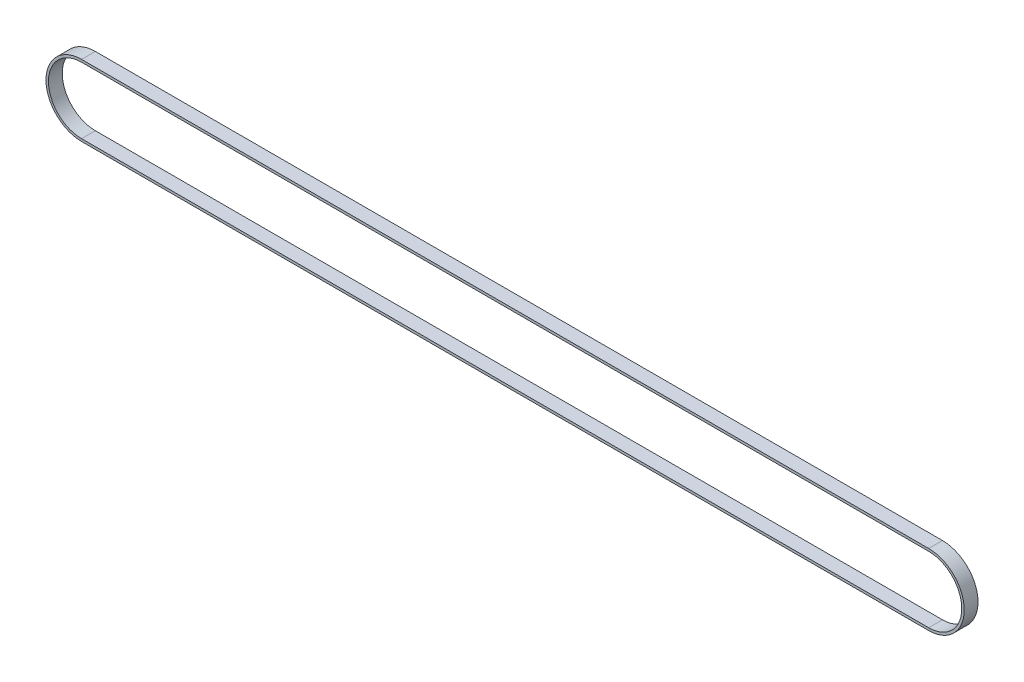
ISO-10303-21;
HEADER;
FILE_DESCRIPTION(('STEP AP214'),'2;1');
FILE_NAME('part.step','',(''),(''),'','','');
FILE_SCHEMA(('AUTOMOTIVE_DESIGN { 1 0 10303 214 1 1 1 1 }'));
ENDSEC;
DATA;
#1=APPLICATION_CONTEXT('core data for automotive mechanical design processes');
#2=APPLICATION_PROTOCOL_DEFINITION('international standard','automotive_design',2000,#1);
#3=PRODUCT_CONTEXT('',#1,'mechanical');
#4=PRODUCT('Part','Part','',(#3));
#5=PRODUCT_RELATED_PRODUCT_CATEGORY('part','',(#4));
#6=PRODUCT_DEFINITION_FORMATION('','',#4);
#7=PRODUCT_DEFINITION_CONTEXT('part definition',#1,'design');
#8=PRODUCT_DEFINITION('design','',#6,#7);
#9=PRODUCT_DEFINITION_SHAPE('','',#8);
#10=(LENGTH_UNIT() NAMED_UNIT(*) SI_UNIT(.MILLI.,.METRE.));
#11=(NAMED_UNIT(*) PLANE_ANGLE_UNIT() SI_UNIT($,.RADIAN.));
#12=(NAMED_UNIT(*) SI_UNIT($,.STERADIAN.) SOLID_ANGLE_UNIT());
#13=UNCERTAINTY_MEASURE_WITH_UNIT(LENGTH_MEASURE(1.E-05),#10,'distance_accuracy_value','');
#14=(GEOMETRIC_REPRESENTATION_CONTEXT(3) GLOBAL_UNCERTAINTY_ASSIGNED_CONTEXT((#13)) GLOBAL_UNIT_ASSIGNED_CONTEXT((#10,
#11,#12)) REPRESENTATION_CONTEXT('',''));
#15=CARTESIAN_POINT('',(0.,0.,0.));
#16=DIRECTION('',(0.,0.,1.));
#17=DIRECTION('',(1.,0.,0.));
#18=AXIS2_PLACEMENT_3D('',#15,#16,#17);
#19=CARTESIAN_POINT('',(0.,0.,12.7));
#20=DIRECTION('',(0.,0.,1.));
#21=DIRECTION('',(1.,0.,0.));
#22=AXIS2_PLACEMENT_3D('',#19,#20,#21);
#23=PLANE('',#22);
#24=CARTESIAN_POINT('',(0.,0.,12.7));
#25=DIRECTION('',(0.,0.,1.));
#26=DIRECTION('',(1.,0.,0.));
#27=AXIS2_PLACEMENT_3D('',#24,#25,#26);
#28=CIRCLE('',#27,32.74);
#29=CARTESIAN_POINT('',(0.,32.74,12.7));
#30=VERTEX_POINT('',#29);
#31=CARTESIAN_POINT('',(0.,-32.74,12.7));
#32=VERTEX_POINT('',#31);
#33=EDGE_CURVE('E134',#30,#32,#28,.T.);
#34=ORIENTED_EDGE('',*,*,#33,.T.);
#35=DIRECTION('',(1.,0.,0.));
#36=VECTOR('',#35,1.);
#37=CARTESIAN_POINT('',(0.,-32.74,12.7));
#38=LINE('',#37,#36);
#39=CARTESIAN_POINT('',(780.,-32.74,12.7));
#40=VERTEX_POINT('',#39);
#41=EDGE_CURVE('E137',#32,#40,#38,.T.);
#42=ORIENTED_EDGE('',*,*,#41,.T.);
#43=CARTESIAN_POINT('',(780.,0.,12.7));
#44=DIRECTION('',(0.,0.,1.));
#45=DIRECTION('',(1.,0.,0.));
#46=AXIS2_PLACEMENT_3D('',#43,#44,#45);
#47=CIRCLE('',#46,32.74);
#48=CARTESIAN_POINT('',(780.,32.74,12.7));
#49=VERTEX_POINT('',#48);
#50=EDGE_CURVE('E140',#40,#49,#47,.T.);
#51=ORIENTED_EDGE('',*,*,#50,.T.);
#52=DIRECTION('',(-1.,0.,0.));
#53=VECTOR('',#52,1.);
#54=CARTESIAN_POINT('',(0.,32.74,12.7));
#55=LINE('',#54,#53);
#56=EDGE_CURVE('E142',#49,#30,#55,.T.);
#57=ORIENTED_EDGE('',*,*,#56,.T.);
#58=EDGE_LOOP('',(#34,#42,#51,#57));
#59=FACE_BOUND('',#58,.T.);
#60=DIRECTION('',(1.,0.,0.));
#61=VECTOR('',#60,1.);
#62=CARTESIAN_POINT('',(0.,-30.47,12.7));
#63=LINE('',#62,#61);
#64=CARTESIAN_POINT('',(0.,-30.47,12.7));
#65=VERTEX_POINT('',#64);
#66=CARTESIAN_POINT('',(780.,-30.47,12.7));
#67=VERTEX_POINT('',#66);
#68=EDGE_CURVE('E106',#65,#67,#63,.T.);
#69=ORIENTED_EDGE('',*,*,#68,.F.);
#70=CARTESIAN_POINT('',(0.,0.,12.7));
#71=DIRECTION('',(0.,0.,1.));
#72=DIRECTION('',(1.,0.,0.));
#73=AXIS2_PLACEMENT_3D('',#70,#71,#72);
#74=CIRCLE('',#73,30.47);
#75=CARTESIAN_POINT('',(0.,30.47,12.7));
#76=VERTEX_POINT('',#75);
#77=EDGE_CURVE('E98',#76,#65,#74,.T.);
#78=ORIENTED_EDGE('',*,*,#77,.F.);
#79=DIRECTION('',(-1.,0.,0.));
#80=VECTOR('',#79,1.);
#81=CARTESIAN_POINT('',(0.,30.47,12.7));
#82=LINE('',#81,#80);
#83=CARTESIAN_POINT('',(780.,30.47,12.7));
#84=VERTEX_POINT('',#83);
#85=EDGE_CURVE('E120',#84,#76,#82,.T.);
#86=ORIENTED_EDGE('',*,*,#85,.F.);
#87=CARTESIAN_POINT('',(780.,0.,12.7));
#88=DIRECTION('',(0.,0.,1.));
#89=DIRECTION('',(1.,0.,0.));
#90=AXIS2_PLACEMENT_3D('',#87,#88,#89);
#91=CIRCLE('',#90,30.47);
#92=EDGE_CURVE('E118',#67,#84,#91,.T.);
#93=ORIENTED_EDGE('',*,*,#92,.F.);
#94=EDGE_LOOP('',(#69,#78,#86,#93));
#95=FACE_BOUND('',#94,.T.);
#96=ADVANCED_FACE('F33',(#59,#95),#23,.T.);
#97=CARTESIAN_POINT('',(0.,0.,0.));
#98=DIRECTION('',(0.,0.,1.));
#99=DIRECTION('',(1.,0.,0.));
#100=AXIS2_PLACEMENT_3D('',#97,#98,#99);
#101=PLANE('',#100);
#102=CARTESIAN_POINT('',(0.,0.,0.));
#103=DIRECTION('',(0.,0.,1.));
#104=DIRECTION('',(1.,0.,0.));
#105=AXIS2_PLACEMENT_3D('',#102,#103,#104);
#106=CIRCLE('',#105,32.74);
#107=CARTESIAN_POINT('',(0.,32.74,0.));
#108=VERTEX_POINT('',#107);
#109=CARTESIAN_POINT('',(0.,-32.74,0.));
#110=VERTEX_POINT('',#109);
#111=EDGE_CURVE('E114',#108,#110,#106,.T.);
#112=ORIENTED_EDGE('',*,*,#111,.F.);
#113=DIRECTION('',(-1.,0.,0.));
#114=VECTOR('',#113,1.);
#115=CARTESIAN_POINT('',(0.,32.74,0.));
#116=LINE('',#115,#114);
#117=CARTESIAN_POINT('',(780.,32.74,0.));
#118=VERTEX_POINT('',#117);
#119=EDGE_CURVE('E138',#118,#108,#116,.T.);
#120=ORIENTED_EDGE('',*,*,#119,.F.);
#121=CARTESIAN_POINT('',(780.,0.,0.));
#122=DIRECTION('',(0.,0.,1.));
#123=DIRECTION('',(1.,0.,0.));
#124=AXIS2_PLACEMENT_3D('',#121,#122,#123);
#125=CIRCLE('',#124,32.74);
#126=CARTESIAN_POINT('',(780.,-32.74,0.));
#127=VERTEX_POINT('',#126);
#128=EDGE_CURVE('E149',#127,#118,#125,.T.);
#129=ORIENTED_EDGE('',*,*,#128,.F.);
#130=DIRECTION('',(1.,0.,0.));
#131=VECTOR('',#130,1.);
#132=CARTESIAN_POINT('',(0.,-32.74,0.));
#133=LINE('',#132,#131);
#134=EDGE_CURVE('E147',#110,#127,#133,.T.);
#135=ORIENTED_EDGE('',*,*,#134,.F.);
#136=EDGE_LOOP('',(#112,#120,#129,#135));
#137=FACE_BOUND('',#136,.T.);
#138=CARTESIAN_POINT('',(0.,0.,0.));
#139=DIRECTION('',(0.,0.,1.));
#140=DIRECTION('',(1.,0.,0.));
#141=AXIS2_PLACEMENT_3D('',#138,#139,#140);
#142=CIRCLE('',#141,30.47);
#143=CARTESIAN_POINT('',(0.,30.47,0.));
#144=VERTEX_POINT('',#143);
#145=CARTESIAN_POINT('',(0.,-30.47,0.));
#146=VERTEX_POINT('',#145);
#147=EDGE_CURVE('E56',#144,#146,#142,.T.);
#148=ORIENTED_EDGE('',*,*,#147,.T.);
#149=DIRECTION('',(1.,0.,0.));
#150=VECTOR('',#149,1.);
#151=CARTESIAN_POINT('',(0.,-30.47,0.));
#152=LINE('',#151,#150);
#153=CARTESIAN_POINT('',(780.,-30.47,0.));
#154=VERTEX_POINT('',#153);
#155=EDGE_CURVE('E113',#146,#154,#152,.T.);
#156=ORIENTED_EDGE('',*,*,#155,.T.);
#157=CARTESIAN_POINT('',(780.,0.,0.));
#158=DIRECTION('',(0.,0.,1.));
#159=DIRECTION('',(1.,0.,0.));
#160=AXIS2_PLACEMENT_3D('',#157,#158,#159);
#161=CIRCLE('',#160,30.47);
#162=CARTESIAN_POINT('',(780.,30.47,0.));
#163=VERTEX_POINT('',#162);
#164=EDGE_CURVE('E126',#154,#163,#161,.T.);
#165=ORIENTED_EDGE('',*,*,#164,.T.);
#166=DIRECTION('',(-1.,0.,0.));
#167=VECTOR('',#166,1.);
#168=CARTESIAN_POINT('',(0.,30.47,0.));
#169=LINE('',#168,#167);
#170=EDGE_CURVE('E107',#163,#144,#169,.T.);
#171=ORIENTED_EDGE('',*,*,#170,.T.);
#172=EDGE_LOOP('',(#148,#156,#165,#171));
#173=FACE_BOUND('',#172,.T.);
#174=ADVANCED_FACE('F167',(#137,#173),#101,.F.);
#175=CARTESIAN_POINT('',(0.,0.,12.7));
#176=DIRECTION('',(0.,0.,-1.));
#177=DIRECTION('',(-1.,0.,0.));
#178=AXIS2_PLACEMENT_3D('',#175,#176,#177);
#179=CYLINDRICAL_SURFACE('',#178,32.74);
#180=ORIENTED_EDGE('',*,*,#111,.T.);
#181=DIRECTION('',(0.,0.,-1.));
#182=VECTOR('',#181,1.);
#183=CARTESIAN_POINT('',(0.,-32.74,12.7));
#184=LINE('',#183,#182);
#185=EDGE_CURVE('E11',#32,#110,#184,.T.);
#186=ORIENTED_EDGE('',*,*,#185,.F.);
#187=ORIENTED_EDGE('',*,*,#33,.F.);
#188=DIRECTION('',(0.,0.,-1.));
#189=VECTOR('',#188,1.);
#190=CARTESIAN_POINT('',(0.,32.74,12.7));
#191=LINE('',#190,#189);
#192=EDGE_CURVE('E144',#30,#108,#191,.T.);
#193=ORIENTED_EDGE('',*,*,#192,.T.);
#194=EDGE_LOOP('',(#180,#186,#187,#193));
#195=FACE_BOUND('',#194,.T.);
#196=ADVANCED_FACE('F35',(#195),#179,.T.);
#197=CARTESIAN_POINT('',(0.,-32.74,12.7));
#198=DIRECTION('',(0.,1.,0.));
#199=DIRECTION('',(0.,0.,1.));
#200=AXIS2_PLACEMENT_3D('',#197,#198,#199);
#201=PLANE('',#200);
#202=ORIENTED_EDGE('',*,*,#134,.T.);
#203=DIRECTION('',(0.,0.,-1.));
#204=VECTOR('',#203,1.);
#205=CARTESIAN_POINT('',(780.,-32.74,12.7));
#206=LINE('',#205,#204);
#207=EDGE_CURVE('E41',#40,#127,#206,.T.);
#208=ORIENTED_EDGE('',*,*,#207,.F.);
#209=ORIENTED_EDGE('',*,*,#41,.F.);
#210=ORIENTED_EDGE('',*,*,#185,.T.);
#211=EDGE_LOOP('',(#202,#208,#209,#210));
#212=FACE_BOUND('',#211,.T.);
#213=ADVANCED_FACE('F177',(#212),#201,.F.);
#214=CARTESIAN_POINT('',(780.,0.,12.7));
#215=DIRECTION('',(0.,0.,-1.));
#216=DIRECTION('',(-1.,0.,0.));
#217=AXIS2_PLACEMENT_3D('',#214,#215,#216);
#218=CYLINDRICAL_SURFACE('',#217,32.74);
#219=ORIENTED_EDGE('',*,*,#128,.T.);
#220=DIRECTION('',(0.,0.,-1.));
#221=VECTOR('',#220,1.);
#222=CARTESIAN_POINT('',(780.,32.74,12.7));
#223=LINE('',#222,#221);
#224=EDGE_CURVE('E154',#49,#118,#223,.T.);
#225=ORIENTED_EDGE('',*,*,#224,.F.);
#226=ORIENTED_EDGE('',*,*,#50,.F.);
#227=ORIENTED_EDGE('',*,*,#207,.T.);
#228=EDGE_LOOP('',(#219,#225,#226,#227));
#229=FACE_BOUND('',#228,.T.);
#230=ADVANCED_FACE('F161',(#229),#218,.T.);
#231=CARTESIAN_POINT('',(0.,32.74,12.7));
#232=DIRECTION('',(0.,-1.,0.));
#233=DIRECTION('',(0.,0.,-1.));
#234=AXIS2_PLACEMENT_3D('',#231,#232,#233);
#235=PLANE('',#234);
#236=ORIENTED_EDGE('',*,*,#119,.T.);
#237=ORIENTED_EDGE('',*,*,#192,.F.);
#238=ORIENTED_EDGE('',*,*,#56,.F.);
#239=ORIENTED_EDGE('',*,*,#224,.T.);
#240=EDGE_LOOP('',(#236,#237,#238,#239));
#241=FACE_BOUND('',#240,.T.);
#242=ADVANCED_FACE('F171',(#241),#235,.F.);
#243=CARTESIAN_POINT('',(0.,0.,12.7));
#244=DIRECTION('',(0.,0.,-1.));
#245=DIRECTION('',(-1.,0.,0.));
#246=AXIS2_PLACEMENT_3D('',#243,#244,#245);
#247=CYLINDRICAL_SURFACE('',#246,30.47);
#248=ORIENTED_EDGE('',*,*,#147,.F.);
#249=DIRECTION('',(0.,0.,-1.));
#250=VECTOR('',#249,1.);
#251=CARTESIAN_POINT('',(0.,30.47,12.7));
#252=LINE('',#251,#250);
#253=EDGE_CURVE('E102',#76,#144,#252,.T.);
#254=ORIENTED_EDGE('',*,*,#253,.F.);
#255=ORIENTED_EDGE('',*,*,#77,.T.);
#256=DIRECTION('',(0.,0.,-1.));
#257=VECTOR('',#256,1.);
#258=CARTESIAN_POINT('',(0.,-30.47,12.7));
#259=LINE('',#258,#257);
#260=EDGE_CURVE('E101',#65,#146,#259,.T.);
#261=ORIENTED_EDGE('',*,*,#260,.T.);
#262=EDGE_LOOP('',(#248,#254,#255,#261));
#263=FACE_BOUND('',#262,.T.);
#264=ADVANCED_FACE('F100',(#263),#247,.F.);
#265=CARTESIAN_POINT('',(0.,-30.47,12.7));
#266=DIRECTION('',(0.,1.,0.));
#267=DIRECTION('',(0.,0.,1.));
#268=AXIS2_PLACEMENT_3D('',#265,#266,#267);
#269=PLANE('',#268);
#270=ORIENTED_EDGE('',*,*,#155,.F.);
#271=ORIENTED_EDGE('',*,*,#260,.F.);
#272=ORIENTED_EDGE('',*,*,#68,.T.);
#273=DIRECTION('',(0.,0.,-1.));
#274=VECTOR('',#273,1.);
#275=CARTESIAN_POINT('',(780.,-30.47,12.7));
#276=LINE('',#275,#274);
#277=EDGE_CURVE('E115',#67,#154,#276,.T.);
#278=ORIENTED_EDGE('',*,*,#277,.T.);
#279=EDGE_LOOP('',(#270,#271,#272,#278));
#280=FACE_BOUND('',#279,.T.);
#281=ADVANCED_FACE('F110',(#280),#269,.T.);
#282=CARTESIAN_POINT('',(780.,0.,12.7));
#283=DIRECTION('',(0.,0.,-1.));
#284=DIRECTION('',(-1.,0.,0.));
#285=AXIS2_PLACEMENT_3D('',#282,#283,#284);
#286=CYLINDRICAL_SURFACE('',#285,30.47);
#287=ORIENTED_EDGE('',*,*,#164,.F.);
#288=ORIENTED_EDGE('',*,*,#277,.F.);
#289=ORIENTED_EDGE('',*,*,#92,.T.);
#290=DIRECTION('',(0.,0.,-1.));
#291=VECTOR('',#290,1.);
#292=CARTESIAN_POINT('',(780.,30.47,12.7));
#293=LINE('',#292,#291);
#294=EDGE_CURVE('E48',#84,#163,#293,.T.);
#295=ORIENTED_EDGE('',*,*,#294,.T.);
#296=EDGE_LOOP('',(#287,#288,#289,#295));
#297=FACE_BOUND('',#296,.T.);
#298=ADVANCED_FACE('F200',(#297),#286,.F.);
#299=CARTESIAN_POINT('',(0.,30.47,12.7));
#300=DIRECTION('',(0.,-1.,0.));
#301=DIRECTION('',(0.,0.,-1.));
#302=AXIS2_PLACEMENT_3D('',#299,#300,#301);
#303=PLANE('',#302);
#304=ORIENTED_EDGE('',*,*,#170,.F.);
#305=ORIENTED_EDGE('',*,*,#294,.F.);
#306=ORIENTED_EDGE('',*,*,#85,.T.);
#307=ORIENTED_EDGE('',*,*,#253,.T.);
#308=EDGE_LOOP('',(#304,#305,#306,#307));
#309=FACE_BOUND('',#308,.T.);
#310=ADVANCED_FACE('F204',(#309),#303,.T.);
#311=CLOSED_SHELL('',(#96,#174,#196,#213,#230,#242,#264,#281,#298,#310));
#312=MANIFOLD_SOLID_BREP('B2',#311);
#313=ADVANCED_BREP_SHAPE_REPRESENTATION('',(#18,#312),#14);
#314=SHAPE_DEFINITION_REPRESENTATION(#9,#313);
ENDSEC;
END-ISO-10303-21;
